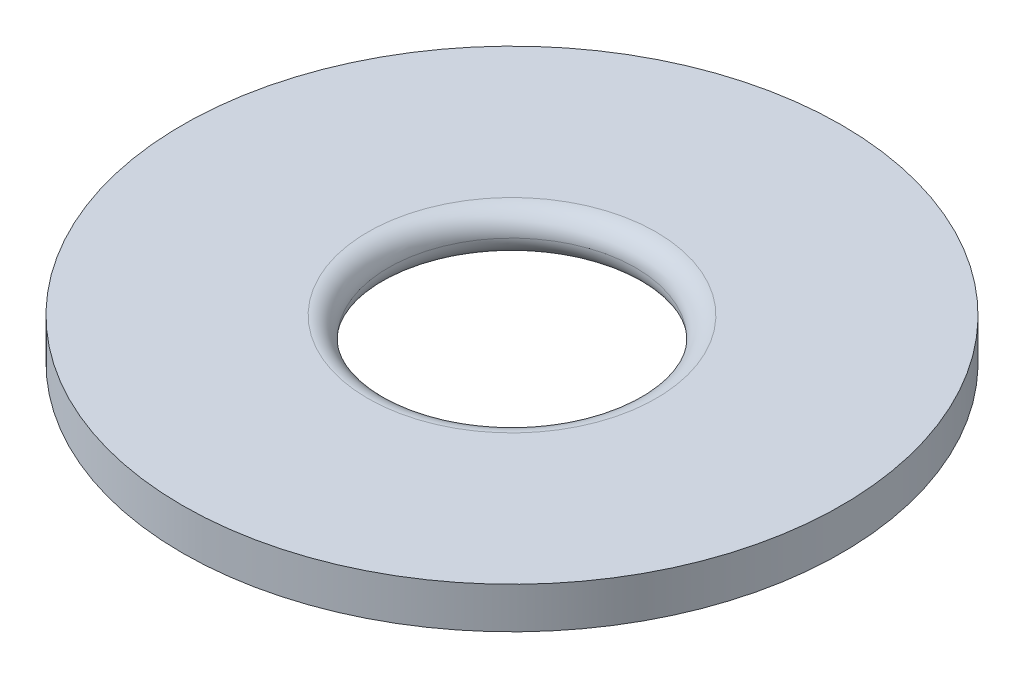
ISO-10303-21;
HEADER;
FILE_DESCRIPTION(('STEP AP214'),'2;1');
FILE_NAME('part.step','',(''),(''),'','','');
FILE_SCHEMA(('AUTOMOTIVE_DESIGN { 1 0 10303 214 1 1 1 1 }'));
ENDSEC;
DATA;
#1=APPLICATION_CONTEXT('core data for automotive mechanical design processes');
#2=APPLICATION_PROTOCOL_DEFINITION('international standard','automotive_design',2000,#1);
#3=PRODUCT_CONTEXT('',#1,'mechanical');
#4=PRODUCT('Part','Part','',(#3));
#5=PRODUCT_RELATED_PRODUCT_CATEGORY('part','',(#4));
#6=PRODUCT_DEFINITION_FORMATION('','',#4);
#7=PRODUCT_DEFINITION_CONTEXT('part definition',#1,'design');
#8=PRODUCT_DEFINITION('design','',#6,#7);
#9=PRODUCT_DEFINITION_SHAPE('','',#8);
#10=(LENGTH_UNIT() NAMED_UNIT(*) SI_UNIT(.MILLI.,.METRE.));
#11=(NAMED_UNIT(*) PLANE_ANGLE_UNIT() SI_UNIT($,.RADIAN.));
#12=(NAMED_UNIT(*) SI_UNIT($,.STERADIAN.) SOLID_ANGLE_UNIT());
#13=UNCERTAINTY_MEASURE_WITH_UNIT(LENGTH_MEASURE(1.E-05),#10,'distance_accuracy_value','');
#14=(GEOMETRIC_REPRESENTATION_CONTEXT(3) GLOBAL_UNCERTAINTY_ASSIGNED_CONTEXT((#13)) GLOBAL_UNIT_ASSIGNED_CONTEXT((#10,
#11,#12)) REPRESENTATION_CONTEXT('',''));
#15=CARTESIAN_POINT('',(0.,0.,0.));
#16=DIRECTION('',(0.,0.,1.));
#17=DIRECTION('',(1.,0.,0.));
#18=AXIS2_PLACEMENT_3D('',#15,#16,#17);
#19=CARTESIAN_POINT('',(0.,0.79375,0.));
#20=DIRECTION('',(0.,1.,0.));
#21=DIRECTION('',(0.,0.,1.));
#22=AXIS2_PLACEMENT_3D('',#19,#20,#21);
#23=PLANE('',#22);
#24=CARTESIAN_POINT('',(0.,0.79375,0.));
#25=DIRECTION('',(0.,1.,0.));
#26=DIRECTION('',(0.,0.,1.));
#27=AXIS2_PLACEMENT_3D('',#24,#25,#26);
#28=CIRCLE('',#27,2.778125);
#29=CARTESIAN_POINT('',(0.,0.79375,2.778125));
#30=VERTEX_POINT('',#29);
#31=EDGE_CURVE('E10',#30,#30,#28,.F.);
#32=ORIENTED_EDGE('',*,*,#31,.T.);
#33=EDGE_LOOP('',(#32));
#34=FACE_BOUND('',#33,.T.);
#35=CARTESIAN_POINT('',(0.,0.79375,0.));
#36=DIRECTION('',(0.,1.,0.));
#37=DIRECTION('',(0.,0.,1.));
#38=AXIS2_PLACEMENT_3D('',#35,#36,#37);
#39=CIRCLE('',#38,6.35);
#40=CARTESIAN_POINT('',(0.,0.79375,6.35));
#41=VERTEX_POINT('',#40);
#42=EDGE_CURVE('E43',#41,#41,#39,.T.);
#43=ORIENTED_EDGE('',*,*,#42,.T.);
#44=EDGE_LOOP('',(#43));
#45=FACE_BOUND('',#44,.T.);
#46=ADVANCED_FACE('F31',(#34,#45),#23,.T.);
#47=CARTESIAN_POINT('',(0.,0.,0.));
#48=DIRECTION('',(0.,1.,0.));
#49=DIRECTION('',(0.,0.,1.));
#50=AXIS2_PLACEMENT_3D('',#47,#48,#49);
#51=PLANE('',#50);
#52=CARTESIAN_POINT('',(0.,0.,0.));
#53=DIRECTION('',(0.,1.,0.));
#54=DIRECTION('',(0.,0.,1.));
#55=AXIS2_PLACEMENT_3D('',#52,#53,#54);
#56=CIRCLE('',#55,2.778125);
#57=CARTESIAN_POINT('',(0.,0.,2.778125));
#58=VERTEX_POINT('',#57);
#59=EDGE_CURVE('E39',#58,#58,#56,.T.);
#60=ORIENTED_EDGE('',*,*,#59,.T.);
#61=EDGE_LOOP('',(#60));
#62=FACE_BOUND('',#61,.T.);
#63=CARTESIAN_POINT('',(0.,0.,0.));
#64=DIRECTION('',(0.,1.,0.));
#65=DIRECTION('',(0.,0.,1.));
#66=AXIS2_PLACEMENT_3D('',#63,#64,#65);
#67=CIRCLE('',#66,6.35);
#68=CARTESIAN_POINT('',(0.,0.,6.35));
#69=VERTEX_POINT('',#68);
#70=EDGE_CURVE('E46',#69,#69,#67,.T.);
#71=ORIENTED_EDGE('',*,*,#70,.F.);
#72=EDGE_LOOP('',(#71));
#73=FACE_BOUND('',#72,.T.);
#74=ADVANCED_FACE('F56',(#62,#73),#51,.F.);
#75=CARTESIAN_POINT('',(0.,0.79375,0.));
#76=DIRECTION('',(0.,-1.,0.));
#77=DIRECTION('',(0.,0.,-1.));
#78=AXIS2_PLACEMENT_3D('',#75,#76,#77);
#79=CYLINDRICAL_SURFACE('',#78,6.35);
#80=ORIENTED_EDGE('',*,*,#42,.F.);
#81=EDGE_LOOP('',(#80));
#82=FACE_BOUND('',#81,.T.);
#83=ORIENTED_EDGE('',*,*,#70,.T.);
#84=EDGE_LOOP('',(#83));
#85=FACE_BOUND('',#84,.T.);
#86=ADVANCED_FACE('F53',(#82,#85),#79,.T.);
#87=CARTESIAN_POINT('',(0.,0.396875,0.));
#88=DIRECTION('',(0.,1.,0.));
#89=DIRECTION('',(0.,0.,1.));
#90=AXIS2_PLACEMENT_3D('',#87,#88,#89);
#91=TOROIDAL_SURFACE('',#90,2.778125,0.396875);
#92=ORIENTED_EDGE('',*,*,#31,.F.);
#93=EDGE_LOOP('',(#92));
#94=FACE_BOUND('',#93,.T.);
#95=CARTESIAN_POINT('',(0.,0.396875,0.));
#96=DIRECTION('',(0.,1.,0.));
#97=DIRECTION('',(0.,0.,1.));
#98=AXIS2_PLACEMENT_3D('',#95,#96,#97);
#99=CIRCLE('',#98,2.38125);
#100=CARTESIAN_POINT('',(0.,0.396875,2.38125));
#101=VERTEX_POINT('',#100);
#102=EDGE_CURVE('E35',#101,#101,#99,.T.);
#103=ORIENTED_EDGE('',*,*,#102,.F.);
#104=EDGE_LOOP('',(#103));
#105=FACE_BOUND('',#104,.T.);
#106=ADVANCED_FACE('F33',(#94,#105),#91,.T.);
#107=CARTESIAN_POINT('',(0.,0.396875,0.));
#108=DIRECTION('',(0.,1.,0.));
#109=DIRECTION('',(0.,0.,1.));
#110=AXIS2_PLACEMENT_3D('',#107,#108,#109);
#111=TOROIDAL_SURFACE('',#110,2.778125,0.396875);
#112=ORIENTED_EDGE('',*,*,#102,.T.);
#113=EDGE_LOOP('',(#112));
#114=FACE_BOUND('',#113,.T.);
#115=ORIENTED_EDGE('',*,*,#59,.F.);
#116=EDGE_LOOP('',(#115));
#117=FACE_BOUND('',#116,.T.);
#118=ADVANCED_FACE('F67',(#114,#117),#111,.T.);
#119=CLOSED_SHELL('',(#46,#74,#86,#106,#118));
#120=MANIFOLD_SOLID_BREP('B2',#119);
#121=ADVANCED_BREP_SHAPE_REPRESENTATION('',(#18,#120),#14);
#122=SHAPE_DEFINITION_REPRESENTATION(#9,#121);
ENDSEC;
END-ISO-10303-21;
